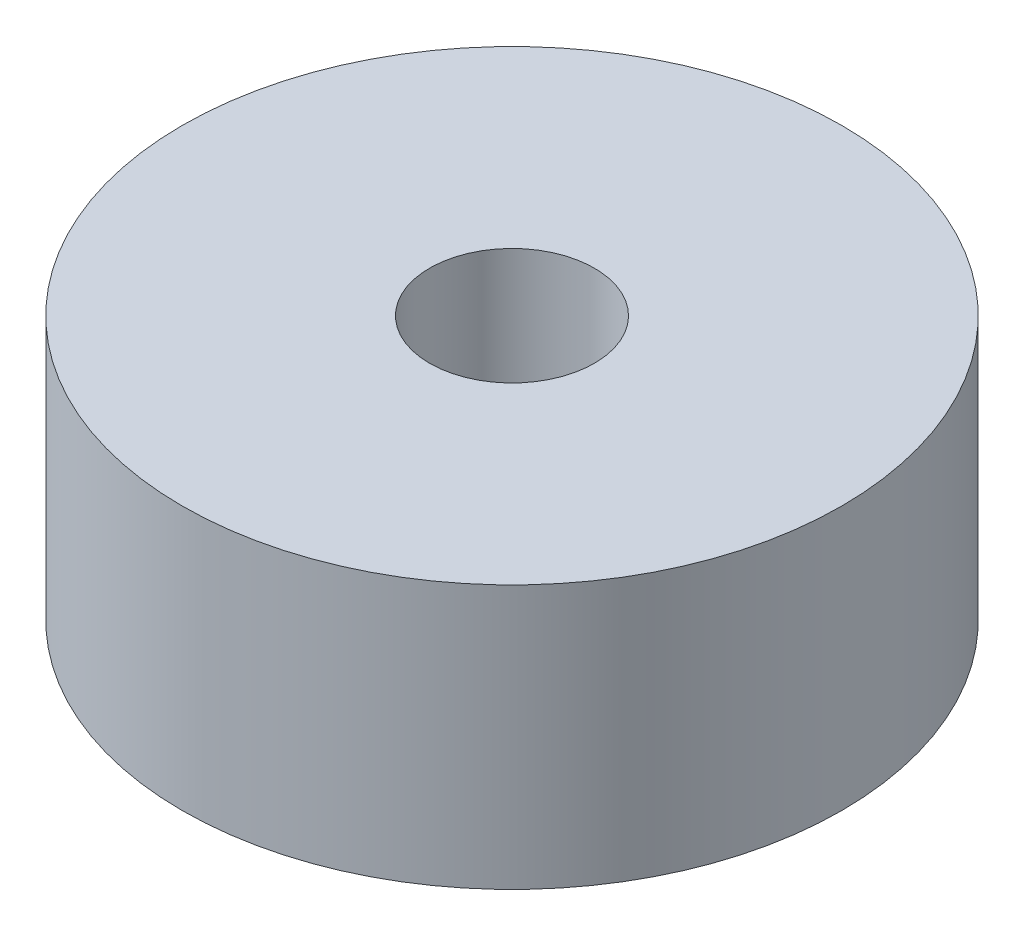
ISO-10303-21;
HEADER;
FILE_DESCRIPTION(('STEP AP214'),'2;1');
FILE_NAME('part.step','',(''),(''),'','','');
FILE_SCHEMA(('AUTOMOTIVE_DESIGN { 1 0 10303 214 1 1 1 1 }'));
ENDSEC;
DATA;
#1=APPLICATION_CONTEXT('core data for automotive mechanical design processes');
#2=APPLICATION_PROTOCOL_DEFINITION('international standard','automotive_design',2000,#1);
#3=PRODUCT_CONTEXT('',#1,'mechanical');
#4=PRODUCT('Part','Part','',(#3));
#5=PRODUCT_RELATED_PRODUCT_CATEGORY('part','',(#4));
#6=PRODUCT_DEFINITION_FORMATION('','',#4);
#7=PRODUCT_DEFINITION_CONTEXT('part definition',#1,'design');
#8=PRODUCT_DEFINITION('design','',#6,#7);
#9=PRODUCT_DEFINITION_SHAPE('','',#8);
#10=(LENGTH_UNIT() NAMED_UNIT(*) SI_UNIT(.MILLI.,.METRE.));
#11=(NAMED_UNIT(*) PLANE_ANGLE_UNIT() SI_UNIT($,.RADIAN.));
#12=(NAMED_UNIT(*) SI_UNIT($,.STERADIAN.) SOLID_ANGLE_UNIT());
#13=UNCERTAINTY_MEASURE_WITH_UNIT(LENGTH_MEASURE(1.E-05),#10,'distance_accuracy_value','');
#14=(GEOMETRIC_REPRESENTATION_CONTEXT(3) GLOBAL_UNCERTAINTY_ASSIGNED_CONTEXT((#13)) GLOBAL_UNIT_ASSIGNED_CONTEXT((#10,
#11,#12)) REPRESENTATION_CONTEXT('',''));
#15=CARTESIAN_POINT('',(0.,0.,0.));
#16=DIRECTION('',(0.,0.,1.));
#17=DIRECTION('',(1.,0.,0.));
#18=AXIS2_PLACEMENT_3D('',#15,#16,#17);
#19=CARTESIAN_POINT('',(0.,8.,0.));
#20=DIRECTION('',(0.,-1.,0.));
#21=DIRECTION('',(0.,0.,-1.));
#22=AXIS2_PLACEMENT_3D('',#19,#20,#21);
#23=CYLINDRICAL_SURFACE('',#22,10.);
#24=CARTESIAN_POINT('',(0.,8.,0.));
#25=DIRECTION('',(0.,1.,0.));
#26=DIRECTION('',(0.,0.,1.));
#27=AXIS2_PLACEMENT_3D('',#24,#25,#26);
#28=CIRCLE('',#27,10.);
#29=CARTESIAN_POINT('',(0.,8.,10.));
#30=VERTEX_POINT('',#29);
#31=EDGE_CURVE('E10',#30,#30,#28,.T.);
#32=ORIENTED_EDGE('',*,*,#31,.F.);
#33=EDGE_LOOP('',(#32));
#34=FACE_BOUND('',#33,.T.);
#35=CARTESIAN_POINT('',(0.,0.,0.));
#36=DIRECTION('',(0.,1.,0.));
#37=DIRECTION('',(0.,0.,1.));
#38=AXIS2_PLACEMENT_3D('',#35,#36,#37);
#39=CIRCLE('',#38,10.);
#40=CARTESIAN_POINT('',(0.,0.,10.));
#41=VERTEX_POINT('',#40);
#42=EDGE_CURVE('E40',#41,#41,#39,.T.);
#43=ORIENTED_EDGE('',*,*,#42,.T.);
#44=EDGE_LOOP('',(#43));
#45=FACE_BOUND('',#44,.T.);
#46=ADVANCED_FACE('F37',(#34,#45),#23,.T.);
#47=CARTESIAN_POINT('',(0.,8.,0.));
#48=DIRECTION('',(0.,1.,0.));
#49=DIRECTION('',(0.,0.,1.));
#50=AXIS2_PLACEMENT_3D('',#47,#48,#49);
#51=PLANE('',#50);
#52=CARTESIAN_POINT('',(0.,8.,0.));
#53=DIRECTION('',(0.,1.,0.));
#54=DIRECTION('',(0.,0.,1.));
#55=AXIS2_PLACEMENT_3D('',#52,#53,#54);
#56=CIRCLE('',#55,2.5);
#57=CARTESIAN_POINT('',(0.,8.,2.5));
#58=VERTEX_POINT('',#57);
#59=EDGE_CURVE('E49',#58,#58,#56,.T.);
#60=ORIENTED_EDGE('',*,*,#59,.F.);
#61=EDGE_LOOP('',(#60));
#62=FACE_BOUND('',#61,.T.);
#63=ORIENTED_EDGE('',*,*,#31,.T.);
#64=EDGE_LOOP('',(#63));
#65=FACE_BOUND('',#64,.T.);
#66=ADVANCED_FACE('F64',(#62,#65),#51,.T.);
#67=CARTESIAN_POINT('',(0.,0.,0.));
#68=DIRECTION('',(0.,1.,0.));
#69=DIRECTION('',(0.,0.,1.));
#70=AXIS2_PLACEMENT_3D('',#67,#68,#69);
#71=PLANE('',#70);
#72=CARTESIAN_POINT('',(0.,0.,0.));
#73=DIRECTION('',(0.,1.,0.));
#74=DIRECTION('',(0.,0.,1.));
#75=AXIS2_PLACEMENT_3D('',#72,#73,#74);
#76=CIRCLE('',#75,2.5);
#77=CARTESIAN_POINT('',(0.,0.,2.5));
#78=VERTEX_POINT('',#77);
#79=EDGE_CURVE('E47',#78,#78,#76,.T.);
#80=ORIENTED_EDGE('',*,*,#79,.T.);
#81=EDGE_LOOP('',(#80));
#82=FACE_BOUND('',#81,.T.);
#83=ORIENTED_EDGE('',*,*,#42,.F.);
#84=EDGE_LOOP('',(#83));
#85=FACE_BOUND('',#84,.T.);
#86=ADVANCED_FACE('F55',(#82,#85),#71,.F.);
#87=CARTESIAN_POINT('',(0.,0.,0.));
#88=DIRECTION('',(0.,1.,0.));
#89=DIRECTION('',(0.,0.,1.));
#90=AXIS2_PLACEMENT_3D('',#87,#88,#89);
#91=CYLINDRICAL_SURFACE('',#90,2.5);
#92=ORIENTED_EDGE('',*,*,#79,.F.);
#93=EDGE_LOOP('',(#92));
#94=FACE_BOUND('',#93,.T.);
#95=ORIENTED_EDGE('',*,*,#59,.T.);
#96=EDGE_LOOP('',(#95));
#97=FACE_BOUND('',#96,.T.);
#98=ADVANCED_FACE('F58',(#94,#97),#91,.F.);
#99=CLOSED_SHELL('',(#46,#66,#86,#98));
#100=MANIFOLD_SOLID_BREP('B2',#99);
#101=ADVANCED_BREP_SHAPE_REPRESENTATION('',(#18,#100),#14);
#102=SHAPE_DEFINITION_REPRESENTATION(#9,#101);
ENDSEC;
END-ISO-10303-21;
